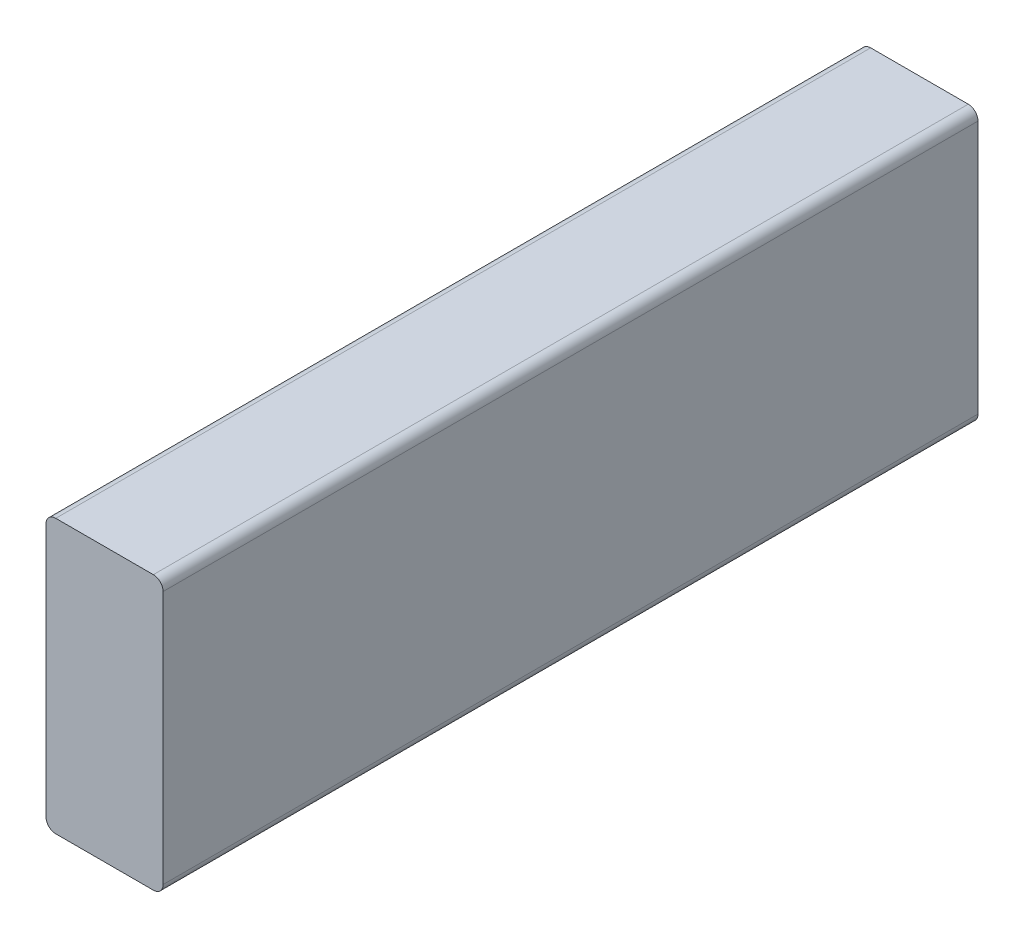
ISO-10303-21;
HEADER;
FILE_DESCRIPTION(('STEP AP214'),'2;1');
FILE_NAME('part.step','',(''),(''),'','','');
FILE_SCHEMA(('AUTOMOTIVE_DESIGN { 1 0 10303 214 1 1 1 1 }'));
ENDSEC;
DATA;
#1=APPLICATION_CONTEXT('core data for automotive mechanical design processes');
#2=APPLICATION_PROTOCOL_DEFINITION('international standard','automotive_design',2000,#1);
#3=PRODUCT_CONTEXT('',#1,'mechanical');
#4=PRODUCT('Part','Part','',(#3));
#5=PRODUCT_RELATED_PRODUCT_CATEGORY('part','',(#4));
#6=PRODUCT_DEFINITION_FORMATION('','',#4);
#7=PRODUCT_DEFINITION_CONTEXT('part definition',#1,'design');
#8=PRODUCT_DEFINITION('design','',#6,#7);
#9=PRODUCT_DEFINITION_SHAPE('','',#8);
#10=(LENGTH_UNIT() NAMED_UNIT(*) SI_UNIT(.MILLI.,.METRE.));
#11=(NAMED_UNIT(*) PLANE_ANGLE_UNIT() SI_UNIT($,.RADIAN.));
#12=(NAMED_UNIT(*) SI_UNIT($,.STERADIAN.) SOLID_ANGLE_UNIT());
#13=UNCERTAINTY_MEASURE_WITH_UNIT(LENGTH_MEASURE(1.E-05),#10,'distance_accuracy_value','');
#14=(GEOMETRIC_REPRESENTATION_CONTEXT(3) GLOBAL_UNCERTAINTY_ASSIGNED_CONTEXT((#13)) GLOBAL_UNIT_ASSIGNED_CONTEXT((#10,
#11,#12)) REPRESENTATION_CONTEXT('',''));
#15=CARTESIAN_POINT('',(0.,0.,0.));
#16=DIRECTION('',(0.,0.,1.));
#17=DIRECTION('',(1.,0.,0.));
#18=AXIS2_PLACEMENT_3D('',#15,#16,#17);
#19=CARTESIAN_POINT('',(0.,0.,-265.1125));
#20=DIRECTION('',(-1.,0.,0.));
#21=DIRECTION('',(0.,0.,1.));
#22=AXIS2_PLACEMENT_3D('',#19,#20,#21);
#23=PLANE('',#22);
#24=DIRECTION('',(0.,-1.,0.));
#25=VECTOR('',#24,1.);
#26=CARTESIAN_POINT('',(0.,0.,-265.1125));
#27=LINE('',#26,#25);
#28=CARTESIAN_POINT('',(0.,85.725,-265.1125));
#29=VERTEX_POINT('',#28);
#30=CARTESIAN_POINT('',(0.,3.175,-265.1125));
#31=VERTEX_POINT('',#30);
#32=EDGE_CURVE('E162',#29,#31,#27,.T.);
#33=ORIENTED_EDGE('',*,*,#32,.T.);
#34=DIRECTION('',(0.,0.,1.));
#35=VECTOR('',#34,1.);
#36=CARTESIAN_POINT('',(0.,3.175,-265.1125));
#37=LINE('',#36,#35);
#38=CARTESIAN_POINT('',(0.,3.175,0.));
#39=VERTEX_POINT('',#38);
#40=EDGE_CURVE('E118',#31,#39,#37,.T.);
#41=ORIENTED_EDGE('',*,*,#40,.T.);
#42=DIRECTION('',(0.,-1.,0.));
#43=VECTOR('',#42,1.);
#44=CARTESIAN_POINT('',(0.,0.,0.));
#45=LINE('',#44,#43);
#46=CARTESIAN_POINT('',(0.,85.725,0.));
#47=VERTEX_POINT('',#46);
#48=EDGE_CURVE('E103',#47,#39,#45,.T.);
#49=ORIENTED_EDGE('',*,*,#48,.F.);
#50=DIRECTION('',(0.,0.,1.));
#51=VECTOR('',#50,1.);
#52=CARTESIAN_POINT('',(0.,85.725,-265.1125));
#53=LINE('',#52,#51);
#54=EDGE_CURVE('E115',#47,#29,#53,.F.);
#55=ORIENTED_EDGE('',*,*,#54,.T.);
#56=EDGE_LOOP('',(#33,#41,#49,#55));
#57=FACE_BOUND('',#56,.T.);
#58=ADVANCED_FACE('F33',(#57),#23,.T.);
#59=CARTESIAN_POINT('',(0.,88.9,-265.1125));
#60=DIRECTION('',(0.,1.,0.));
#61=DIRECTION('',(0.,0.,1.));
#62=AXIS2_PLACEMENT_3D('',#59,#60,#61);
#63=PLANE('',#62);
#64=DIRECTION('',(-1.,0.,0.));
#65=VECTOR('',#64,1.);
#66=CARTESIAN_POINT('',(0.,88.9,-265.1125));
#67=LINE('',#66,#65);
#68=CARTESIAN_POINT('',(34.925,88.9,-265.1125));
#69=VERTEX_POINT('',#68);
#70=CARTESIAN_POINT('',(3.175,88.9,-265.1125));
#71=VERTEX_POINT('',#70);
#72=EDGE_CURVE('E124',#69,#71,#67,.T.);
#73=ORIENTED_EDGE('',*,*,#72,.T.);
#74=DIRECTION('',(0.,0.,1.));
#75=VECTOR('',#74,1.);
#76=CARTESIAN_POINT('',(3.175,88.9,-265.1125));
#77=LINE('',#76,#75);
#78=CARTESIAN_POINT('',(3.175,88.9,0.));
#79=VERTEX_POINT('',#78);
#80=EDGE_CURVE('E11',#71,#79,#77,.T.);
#81=ORIENTED_EDGE('',*,*,#80,.T.);
#82=DIRECTION('',(-1.,0.,0.));
#83=VECTOR('',#82,1.);
#84=CARTESIAN_POINT('',(0.,88.9,0.));
#85=LINE('',#84,#83);
#86=CARTESIAN_POINT('',(34.925,88.9,0.));
#87=VERTEX_POINT('',#86);
#88=EDGE_CURVE('E105',#87,#79,#85,.T.);
#89=ORIENTED_EDGE('',*,*,#88,.F.);
#90=DIRECTION('',(0.,0.,1.));
#91=VECTOR('',#90,1.);
#92=CARTESIAN_POINT('',(34.925,88.9,-265.1125));
#93=LINE('',#92,#91);
#94=EDGE_CURVE('E41',#87,#69,#93,.F.);
#95=ORIENTED_EDGE('',*,*,#94,.T.);
#96=EDGE_LOOP('',(#73,#81,#89,#95));
#97=FACE_BOUND('',#96,.T.);
#98=ADVANCED_FACE('F153',(#97),#63,.T.);
#99=CARTESIAN_POINT('',(38.1,0.,-265.1125));
#100=DIRECTION('',(1.,0.,0.));
#101=DIRECTION('',(0.,0.,-1.));
#102=AXIS2_PLACEMENT_3D('',#99,#100,#101);
#103=PLANE('',#102);
#104=DIRECTION('',(0.,1.,0.));
#105=VECTOR('',#104,1.);
#106=CARTESIAN_POINT('',(38.1,0.,0.));
#107=LINE('',#106,#105);
#108=CARTESIAN_POINT('',(38.1,3.175,0.));
#109=VERTEX_POINT('',#108);
#110=CARTESIAN_POINT('',(38.1,85.725,0.));
#111=VERTEX_POINT('',#110);
#112=EDGE_CURVE('E160',#109,#111,#107,.T.);
#113=ORIENTED_EDGE('',*,*,#112,.F.);
#114=DIRECTION('',(0.,0.,1.));
#115=VECTOR('',#114,1.);
#116=CARTESIAN_POINT('',(38.1,3.175,-265.1125));
#117=LINE('',#116,#115);
#118=CARTESIAN_POINT('',(38.1,3.175,-265.1125));
#119=VERTEX_POINT('',#118);
#120=EDGE_CURVE('E55',#109,#119,#117,.F.);
#121=ORIENTED_EDGE('',*,*,#120,.T.);
#122=DIRECTION('',(0.,1.,0.));
#123=VECTOR('',#122,1.);
#124=CARTESIAN_POINT('',(38.1,0.,-265.1125));
#125=LINE('',#124,#123);
#126=CARTESIAN_POINT('',(38.1,85.725,-265.1125));
#127=VERTEX_POINT('',#126);
#128=EDGE_CURVE('E128',#119,#127,#125,.T.);
#129=ORIENTED_EDGE('',*,*,#128,.T.);
#130=DIRECTION('',(0.,0.,1.));
#131=VECTOR('',#130,1.);
#132=CARTESIAN_POINT('',(38.1,85.725,-265.1125));
#133=LINE('',#132,#131);
#134=EDGE_CURVE('E148',#127,#111,#133,.T.);
#135=ORIENTED_EDGE('',*,*,#134,.T.);
#136=EDGE_LOOP('',(#113,#121,#129,#135));
#137=FACE_BOUND('',#136,.T.);
#138=ADVANCED_FACE('F159',(#137),#103,.T.);
#139=CARTESIAN_POINT('',(0.,0.,-265.1125));
#140=DIRECTION('',(0.,-1.,0.));
#141=DIRECTION('',(0.,0.,-1.));
#142=AXIS2_PLACEMENT_3D('',#139,#140,#141);
#143=PLANE('',#142);
#144=DIRECTION('',(1.,0.,0.));
#145=VECTOR('',#144,1.);
#146=CARTESIAN_POINT('',(0.,0.,0.));
#147=LINE('',#146,#145);
#148=CARTESIAN_POINT('',(3.175,0.,0.));
#149=VERTEX_POINT('',#148);
#150=CARTESIAN_POINT('',(34.925,0.,0.));
#151=VERTEX_POINT('',#150);
#152=EDGE_CURVE('E119',#149,#151,#147,.T.);
#153=ORIENTED_EDGE('',*,*,#152,.F.);
#154=DIRECTION('',(0.,0.,1.));
#155=VECTOR('',#154,1.);
#156=CARTESIAN_POINT('',(3.175,0.,-265.1125));
#157=LINE('',#156,#155);
#158=CARTESIAN_POINT('',(3.175,0.,-265.1125));
#159=VERTEX_POINT('',#158);
#160=EDGE_CURVE('E140',#149,#159,#157,.F.);
#161=ORIENTED_EDGE('',*,*,#160,.T.);
#162=DIRECTION('',(1.,0.,0.));
#163=VECTOR('',#162,1.);
#164=CARTESIAN_POINT('',(0.,0.,-265.1125));
#165=LINE('',#164,#163);
#166=CARTESIAN_POINT('',(34.925,0.,-265.1125));
#167=VERTEX_POINT('',#166);
#168=EDGE_CURVE('E166',#159,#167,#165,.T.);
#169=ORIENTED_EDGE('',*,*,#168,.T.);
#170=DIRECTION('',(0.,0.,1.));
#171=VECTOR('',#170,1.);
#172=CARTESIAN_POINT('',(34.925,0.,-265.1125));
#173=LINE('',#172,#171);
#174=EDGE_CURVE('E137',#167,#151,#173,.T.);
#175=ORIENTED_EDGE('',*,*,#174,.T.);
#176=EDGE_LOOP('',(#153,#161,#169,#175));
#177=FACE_BOUND('',#176,.T.);
#178=ADVANCED_FACE('F175',(#177),#143,.T.);
#179=CARTESIAN_POINT('',(0.,0.,-265.1125));
#180=DIRECTION('',(0.,0.,-1.));
#181=DIRECTION('',(-1.,0.,0.));
#182=AXIS2_PLACEMENT_3D('',#179,#180,#181);
#183=PLANE('',#182);
#184=ORIENTED_EDGE('',*,*,#168,.F.);
#185=CARTESIAN_POINT('',(3.175,3.175,-265.1125));
#186=DIRECTION('',(0.,0.,-1.));
#187=DIRECTION('',(-1.,0.,0.));
#188=AXIS2_PLACEMENT_3D('',#185,#186,#187);
#189=CIRCLE('',#188,3.175);
#190=EDGE_CURVE('E146',#159,#31,#189,.T.);
#191=ORIENTED_EDGE('',*,*,#190,.T.);
#192=ORIENTED_EDGE('',*,*,#32,.F.);
#193=CARTESIAN_POINT('',(3.175,85.725,-265.1125));
#194=DIRECTION('',(0.,0.,-1.));
#195=DIRECTION('',(-1.,0.,0.));
#196=AXIS2_PLACEMENT_3D('',#193,#194,#195);
#197=CIRCLE('',#196,3.175);
#198=EDGE_CURVE('E123',#29,#71,#197,.T.);
#199=ORIENTED_EDGE('',*,*,#198,.T.);
#200=ORIENTED_EDGE('',*,*,#72,.F.);
#201=CARTESIAN_POINT('',(34.925,85.725,-265.1125));
#202=DIRECTION('',(0.,0.,-1.));
#203=DIRECTION('',(-1.,0.,0.));
#204=AXIS2_PLACEMENT_3D('',#201,#202,#203);
#205=CIRCLE('',#204,3.175);
#206=EDGE_CURVE('E48',#69,#127,#205,.T.);
#207=ORIENTED_EDGE('',*,*,#206,.T.);
#208=ORIENTED_EDGE('',*,*,#128,.F.);
#209=CARTESIAN_POINT('',(34.925,3.175,-265.1125));
#210=DIRECTION('',(0.,0.,-1.));
#211=DIRECTION('',(-1.,0.,0.));
#212=AXIS2_PLACEMENT_3D('',#209,#210,#211);
#213=CIRCLE('',#212,3.175);
#214=EDGE_CURVE('E144',#119,#167,#213,.T.);
#215=ORIENTED_EDGE('',*,*,#214,.T.);
#216=EDGE_LOOP('',(#184,#191,#192,#199,#200,#207,#208,#215));
#217=FACE_BOUND('',#216,.T.);
#218=ADVANCED_FACE('F156',(#217),#183,.T.);
#219=CARTESIAN_POINT('',(0.,0.,0.));
#220=DIRECTION('',(0.,0.,-1.));
#221=DIRECTION('',(-1.,0.,0.));
#222=AXIS2_PLACEMENT_3D('',#219,#220,#221);
#223=PLANE('',#222);
#224=ORIENTED_EDGE('',*,*,#48,.T.);
#225=CARTESIAN_POINT('',(3.175,3.175,0.));
#226=DIRECTION('',(0.,0.,-1.));
#227=DIRECTION('',(-1.,0.,0.));
#228=AXIS2_PLACEMENT_3D('',#225,#226,#227);
#229=CIRCLE('',#228,3.175);
#230=EDGE_CURVE('E135',#39,#149,#229,.F.);
#231=ORIENTED_EDGE('',*,*,#230,.T.);
#232=ORIENTED_EDGE('',*,*,#152,.T.);
#233=CARTESIAN_POINT('',(34.925,3.175,0.));
#234=DIRECTION('',(0.,0.,-1.));
#235=DIRECTION('',(-1.,0.,0.));
#236=AXIS2_PLACEMENT_3D('',#233,#234,#235);
#237=CIRCLE('',#236,3.175);
#238=EDGE_CURVE('E109',#151,#109,#237,.F.);
#239=ORIENTED_EDGE('',*,*,#238,.T.);
#240=ORIENTED_EDGE('',*,*,#112,.T.);
#241=CARTESIAN_POINT('',(34.925,85.725,0.));
#242=DIRECTION('',(0.,0.,-1.));
#243=DIRECTION('',(-1.,0.,0.));
#244=AXIS2_PLACEMENT_3D('',#241,#242,#243);
#245=CIRCLE('',#244,3.175);
#246=EDGE_CURVE('E110',#111,#87,#245,.F.);
#247=ORIENTED_EDGE('',*,*,#246,.T.);
#248=ORIENTED_EDGE('',*,*,#88,.T.);
#249=CARTESIAN_POINT('',(3.175,85.725,0.));
#250=DIRECTION('',(0.,0.,-1.));
#251=DIRECTION('',(-1.,0.,0.));
#252=AXIS2_PLACEMENT_3D('',#249,#250,#251);
#253=CIRCLE('',#252,3.175);
#254=EDGE_CURVE('E100',#79,#47,#253,.F.);
#255=ORIENTED_EDGE('',*,*,#254,.T.);
#256=EDGE_LOOP('',(#224,#231,#232,#239,#240,#247,#248,#255));
#257=FACE_BOUND('',#256,.T.);
#258=ADVANCED_FACE('F102',(#257),#223,.F.);
#259=CARTESIAN_POINT('',(3.175,3.175,-265.1125));
#260=DIRECTION('',(0.,0.,1.));
#261=DIRECTION('',(1.,0.,0.));
#262=AXIS2_PLACEMENT_3D('',#259,#260,#261);
#263=CYLINDRICAL_SURFACE('',#262,3.175);
#264=ORIENTED_EDGE('',*,*,#190,.F.);
#265=ORIENTED_EDGE('',*,*,#160,.F.);
#266=ORIENTED_EDGE('',*,*,#230,.F.);
#267=ORIENTED_EDGE('',*,*,#40,.F.);
#268=EDGE_LOOP('',(#264,#265,#266,#267));
#269=FACE_BOUND('',#268,.T.);
#270=ADVANCED_FACE('F171',(#269),#263,.T.);
#271=CARTESIAN_POINT('',(34.925,3.175,-265.1125));
#272=DIRECTION('',(0.,0.,1.));
#273=DIRECTION('',(1.,0.,0.));
#274=AXIS2_PLACEMENT_3D('',#271,#272,#273);
#275=CYLINDRICAL_SURFACE('',#274,3.175);
#276=ORIENTED_EDGE('',*,*,#214,.F.);
#277=ORIENTED_EDGE('',*,*,#120,.F.);
#278=ORIENTED_EDGE('',*,*,#238,.F.);
#279=ORIENTED_EDGE('',*,*,#174,.F.);
#280=EDGE_LOOP('',(#276,#277,#278,#279));
#281=FACE_BOUND('',#280,.T.);
#282=ADVANCED_FACE('F179',(#281),#275,.T.);
#283=CARTESIAN_POINT('',(3.175,85.725,-265.1125));
#284=DIRECTION('',(0.,0.,1.));
#285=DIRECTION('',(1.,0.,0.));
#286=AXIS2_PLACEMENT_3D('',#283,#284,#285);
#287=CYLINDRICAL_SURFACE('',#286,3.175);
#288=ORIENTED_EDGE('',*,*,#198,.F.);
#289=ORIENTED_EDGE('',*,*,#54,.F.);
#290=ORIENTED_EDGE('',*,*,#254,.F.);
#291=ORIENTED_EDGE('',*,*,#80,.F.);
#292=EDGE_LOOP('',(#288,#289,#290,#291));
#293=FACE_BOUND('',#292,.T.);
#294=ADVANCED_FACE('F122',(#293),#287,.T.);
#295=CARTESIAN_POINT('',(34.925,85.725,-265.1125));
#296=DIRECTION('',(0.,0.,1.));
#297=DIRECTION('',(1.,0.,0.));
#298=AXIS2_PLACEMENT_3D('',#295,#296,#297);
#299=CYLINDRICAL_SURFACE('',#298,3.175);
#300=ORIENTED_EDGE('',*,*,#206,.F.);
#301=ORIENTED_EDGE('',*,*,#94,.F.);
#302=ORIENTED_EDGE('',*,*,#246,.F.);
#303=ORIENTED_EDGE('',*,*,#134,.F.);
#304=EDGE_LOOP('',(#300,#301,#302,#303));
#305=FACE_BOUND('',#304,.T.);
#306=ADVANCED_FACE('F35',(#305),#299,.T.);
#307=CLOSED_SHELL('',(#58,#98,#138,#178,#218,#258,#270,#282,#294,#306));
#308=MANIFOLD_SOLID_BREP('B2',#307);
#309=ADVANCED_BREP_SHAPE_REPRESENTATION('',(#18,#308),#14);
#310=SHAPE_DEFINITION_REPRESENTATION(#9,#309);
ENDSEC;
END-ISO-10303-21;
